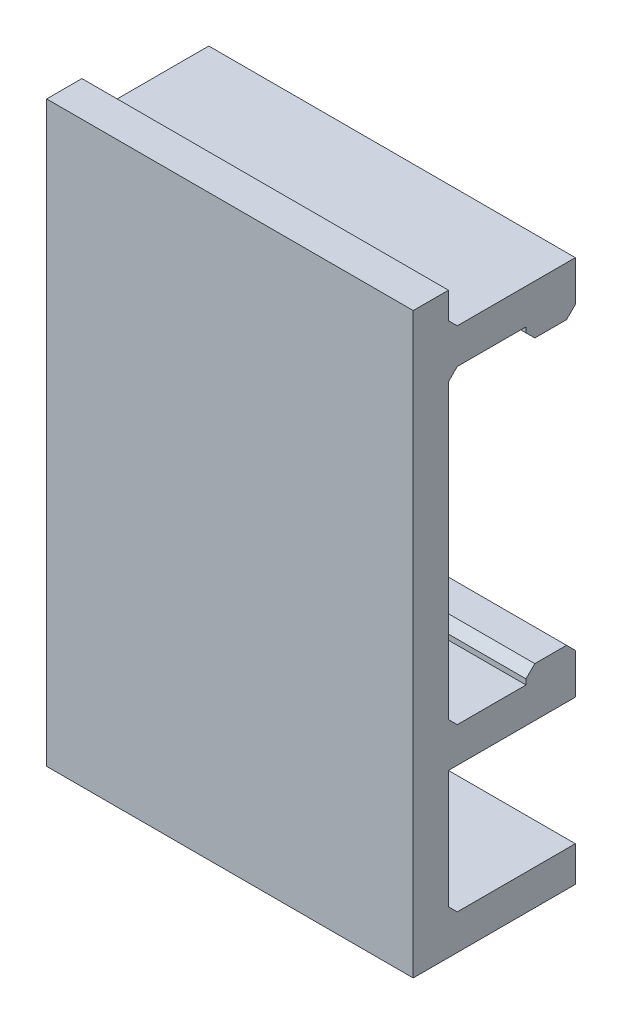
ISO-10303-21;
HEADER;
FILE_DESCRIPTION(('STEP AP214'),'2;1');
FILE_NAME('part.step','',(''),(''),'','','');
FILE_SCHEMA(('AUTOMOTIVE_DESIGN { 1 0 10303 214 1 1 1 1 }'));
ENDSEC;
DATA;
#1=APPLICATION_CONTEXT('core data for automotive mechanical design processes');
#2=APPLICATION_PROTOCOL_DEFINITION('international standard','automotive_design',2000,#1);
#3=PRODUCT_CONTEXT('',#1,'mechanical');
#4=PRODUCT('Part','Part','',(#3));
#5=PRODUCT_RELATED_PRODUCT_CATEGORY('part','',(#4));
#6=PRODUCT_DEFINITION_FORMATION('','',#4);
#7=PRODUCT_DEFINITION_CONTEXT('part definition',#1,'design');
#8=PRODUCT_DEFINITION('design','',#6,#7);
#9=PRODUCT_DEFINITION_SHAPE('','',#8);
#10=(LENGTH_UNIT() NAMED_UNIT(*) SI_UNIT(.MILLI.,.METRE.));
#11=(NAMED_UNIT(*) PLANE_ANGLE_UNIT() SI_UNIT($,.RADIAN.));
#12=(NAMED_UNIT(*) SI_UNIT($,.STERADIAN.) SOLID_ANGLE_UNIT());
#13=UNCERTAINTY_MEASURE_WITH_UNIT(LENGTH_MEASURE(1.E-05),#10,'distance_accuracy_value','');
#14=(GEOMETRIC_REPRESENTATION_CONTEXT(3) GLOBAL_UNCERTAINTY_ASSIGNED_CONTEXT((#13)) GLOBAL_UNIT_ASSIGNED_CONTEXT((#10,
#11,#12)) REPRESENTATION_CONTEXT('',''));
#15=CARTESIAN_POINT('',(0.,0.,0.));
#16=DIRECTION('',(0.,0.,1.));
#17=DIRECTION('',(1.,0.,0.));
#18=AXIS2_PLACEMENT_3D('',#15,#16,#17);
#19=CARTESIAN_POINT('',(2.6,2.9,-1.1));
#20=DIRECTION('',(0.,1.,0.));
#21=DIRECTION('',(0.,0.,1.));
#22=AXIS2_PLACEMENT_3D('',#19,#20,#21);
#23=PLANE('',#22);
#24=DIRECTION('',(1.,0.,0.));
#25=VECTOR('',#24,1.);
#26=CARTESIAN_POINT('',(2.6,2.9,-1.675));
#27=LINE('',#26,#25);
#28=CARTESIAN_POINT('',(-2.6,2.9,-1.675));
#29=VERTEX_POINT('',#28);
#30=CARTESIAN_POINT('',(2.6,2.9,-1.675));
#31=VERTEX_POINT('',#30);
#32=EDGE_CURVE('E235',#29,#31,#27,.T.);
#33=ORIENTED_EDGE('',*,*,#32,.T.);
#34=DIRECTION('',(0.,0.,1.));
#35=VECTOR('',#34,1.);
#36=CARTESIAN_POINT('',(2.6,2.9,-1.1));
#37=LINE('',#36,#35);
#38=CARTESIAN_POINT('',(2.6,2.9,-1.225));
#39=VERTEX_POINT('',#38);
#40=EDGE_CURVE('E20',#39,#31,#37,.F.);
#41=ORIENTED_EDGE('',*,*,#40,.F.);
#42=DIRECTION('',(1.,0.,0.));
#43=VECTOR('',#42,1.);
#44=CARTESIAN_POINT('',(2.6,2.9,-1.225));
#45=LINE('',#44,#43);
#46=CARTESIAN_POINT('',(-2.6,2.9,-1.225));
#47=VERTEX_POINT('',#46);
#48=EDGE_CURVE('E217',#39,#47,#45,.F.);
#49=ORIENTED_EDGE('',*,*,#48,.T.);
#50=DIRECTION('',(0.,0.,1.));
#51=VECTOR('',#50,1.);
#52=CARTESIAN_POINT('',(-2.6,2.9,-1.1));
#53=LINE('',#52,#51);
#54=EDGE_CURVE('E209',#29,#47,#53,.T.);
#55=ORIENTED_EDGE('',*,*,#54,.F.);
#56=EDGE_LOOP('',(#33,#41,#49,#55));
#57=FACE_BOUND('',#56,.T.);
#58=ADVANCED_FACE('F17',(#57),#23,.F.);
#59=CARTESIAN_POINT('',(2.6,2.9,-1.225));
#60=DIRECTION('',(0.,0.707106781186548,-0.707106781186548));
#61=DIRECTION('',(0.,0.707106781186548,0.707106781186548));
#62=AXIS2_PLACEMENT_3D('',#59,#60,#61);
#63=PLANE('',#62);
#64=DIRECTION('',(-1.,0.,0.));
#65=VECTOR('',#64,1.);
#66=CARTESIAN_POINT('',(2.6,3.025,-1.1));
#67=LINE('',#66,#65);
#68=CARTESIAN_POINT('',(2.6,3.025,-1.1));
#69=VERTEX_POINT('',#68);
#70=CARTESIAN_POINT('',(-2.6,3.025,-1.1));
#71=VERTEX_POINT('',#70);
#72=EDGE_CURVE('E224',#69,#71,#67,.T.);
#73=ORIENTED_EDGE('',*,*,#72,.T.);
#74=DIRECTION('',(0.,0.707106781186548,0.707106781186548));
#75=VECTOR('',#74,1.);
#76=CARTESIAN_POINT('',(-2.6,2.9,-1.225));
#77=LINE('',#76,#75);
#78=EDGE_CURVE('E212',#47,#71,#77,.T.);
#79=ORIENTED_EDGE('',*,*,#78,.F.);
#80=ORIENTED_EDGE('',*,*,#48,.F.);
#81=DIRECTION('',(0.,0.707106781186548,0.707106781186548));
#82=VECTOR('',#81,1.);
#83=CARTESIAN_POINT('',(2.6,2.9,-1.225));
#84=LINE('',#83,#82);
#85=EDGE_CURVE('E226',#69,#39,#84,.F.);
#86=ORIENTED_EDGE('',*,*,#85,.F.);
#87=EDGE_LOOP('',(#73,#79,#80,#86));
#88=FACE_BOUND('',#87,.T.);
#89=ADVANCED_FACE('F222',(#88),#63,.F.);
#90=CARTESIAN_POINT('',(2.6,-1.225,-1.1));
#91=DIRECTION('',(0.,-0.707106781186548,-0.707106781186548));
#92=DIRECTION('',(0.,0.707106781186548,-0.707106781186548));
#93=AXIS2_PLACEMENT_3D('',#90,#91,#92);
#94=PLANE('',#93);
#95=DIRECTION('',(1.,0.,0.));
#96=VECTOR('',#95,1.);
#97=CARTESIAN_POINT('',(2.6,-1.1,-1.225));
#98=LINE('',#97,#96);
#99=CARTESIAN_POINT('',(2.6,-1.1,-1.225));
#100=VERTEX_POINT('',#99);
#101=CARTESIAN_POINT('',(-2.6,-1.1,-1.225));
#102=VERTEX_POINT('',#101);
#103=EDGE_CURVE('E253',#100,#102,#98,.F.);
#104=ORIENTED_EDGE('',*,*,#103,.T.);
#105=DIRECTION('',(0.,0.707106781186548,-0.707106781186548));
#106=VECTOR('',#105,1.);
#107=CARTESIAN_POINT('',(-2.6,-1.225,-1.1));
#108=LINE('',#107,#106);
#109=CARTESIAN_POINT('',(-2.6,-1.225,-1.1));
#110=VERTEX_POINT('',#109);
#111=EDGE_CURVE('E228',#110,#102,#108,.T.);
#112=ORIENTED_EDGE('',*,*,#111,.F.);
#113=DIRECTION('',(-1.,0.,0.));
#114=VECTOR('',#113,1.);
#115=CARTESIAN_POINT('',(2.6,-1.225,-1.1));
#116=LINE('',#115,#114);
#117=CARTESIAN_POINT('',(2.6,-1.225,-1.1));
#118=VERTEX_POINT('',#117);
#119=EDGE_CURVE('E246',#110,#118,#116,.F.);
#120=ORIENTED_EDGE('',*,*,#119,.T.);
#121=DIRECTION('',(0.,0.707106781186548,-0.707106781186548));
#122=VECTOR('',#121,1.);
#123=CARTESIAN_POINT('',(2.6,-1.225,-1.1));
#124=LINE('',#123,#122);
#125=EDGE_CURVE('E232',#100,#118,#124,.F.);
#126=ORIENTED_EDGE('',*,*,#125,.F.);
#127=EDGE_LOOP('',(#104,#112,#120,#126));
#128=FACE_BOUND('',#127,.T.);
#129=ADVANCED_FACE('F486',(#128),#94,.F.);
#130=CARTESIAN_POINT('',(2.6,3.025,-1.8));
#131=DIRECTION('',(0.,0.707106781186548,0.707106781186548));
#132=DIRECTION('',(0.,-0.707106781186548,0.707106781186548));
#133=AXIS2_PLACEMENT_3D('',#130,#131,#132);
#134=PLANE('',#133);
#135=ORIENTED_EDGE('',*,*,#32,.F.);
#136=DIRECTION('',(0.,-0.707106781186548,0.707106781186548));
#137=VECTOR('',#136,1.);
#138=CARTESIAN_POINT('',(-2.6,3.025,-1.8));
#139=LINE('',#138,#137);
#140=CARTESIAN_POINT('',(-2.6,3.025,-1.8));
#141=VERTEX_POINT('',#140);
#142=EDGE_CURVE('E215',#141,#29,#139,.T.);
#143=ORIENTED_EDGE('',*,*,#142,.F.);
#144=DIRECTION('',(1.,0.,0.));
#145=VECTOR('',#144,1.);
#146=CARTESIAN_POINT('',(2.6,3.025,-1.8));
#147=LINE('',#146,#145);
#148=CARTESIAN_POINT('',(2.6,3.025,-1.8));
#149=VERTEX_POINT('',#148);
#150=EDGE_CURVE('E260',#141,#149,#147,.T.);
#151=ORIENTED_EDGE('',*,*,#150,.T.);
#152=DIRECTION('',(0.,-0.707106781186548,0.707106781186548));
#153=VECTOR('',#152,1.);
#154=CARTESIAN_POINT('',(2.6,3.025,-1.8));
#155=LINE('',#154,#153);
#156=EDGE_CURVE('E237',#31,#149,#155,.F.);
#157=ORIENTED_EDGE('',*,*,#156,.F.);
#158=EDGE_LOOP('',(#135,#143,#151,#157));
#159=FACE_BOUND('',#158,.T.);
#160=ADVANCED_FACE('F590',(#159),#134,.F.);
#161=CARTESIAN_POINT('',(2.6,3.1,-1.1));
#162=DIRECTION('',(0.,0.,-1.));
#163=DIRECTION('',(-1.,0.,0.));
#164=AXIS2_PLACEMENT_3D('',#161,#162,#163);
#165=PLANE('',#164);
#166=ORIENTED_EDGE('',*,*,#72,.F.);
#167=DIRECTION('',(0.,1.,0.));
#168=VECTOR('',#167,1.);
#169=CARTESIAN_POINT('',(2.6,3.1,-1.1));
#170=LINE('',#169,#168);
#171=CARTESIAN_POINT('',(2.6,3.1,-1.1));
#172=VERTEX_POINT('',#171);
#173=EDGE_CURVE('E239',#172,#69,#170,.F.);
#174=ORIENTED_EDGE('',*,*,#173,.F.);
#175=DIRECTION('',(1.,0.,0.));
#176=VECTOR('',#175,1.);
#177=CARTESIAN_POINT('',(2.6,3.1,-1.1));
#178=LINE('',#177,#176);
#179=CARTESIAN_POINT('',(-2.6,3.1,-1.1));
#180=VERTEX_POINT('',#179);
#181=EDGE_CURVE('E265',#172,#180,#178,.F.);
#182=ORIENTED_EDGE('',*,*,#181,.T.);
#183=DIRECTION('',(0.,1.,0.));
#184=VECTOR('',#183,1.);
#185=CARTESIAN_POINT('',(-2.6,3.1,-1.1));
#186=LINE('',#185,#184);
#187=EDGE_CURVE('E242',#71,#180,#186,.T.);
#188=ORIENTED_EDGE('',*,*,#187,.F.);
#189=EDGE_LOOP('',(#166,#174,#182,#188));
#190=FACE_BOUND('',#189,.T.);
#191=ADVANCED_FACE('F503',(#190),#165,.F.);
#192=CARTESIAN_POINT('',(2.6,-1.3,-1.1));
#193=DIRECTION('',(0.,0.,-1.));
#194=DIRECTION('',(-1.,0.,0.));
#195=AXIS2_PLACEMENT_3D('',#192,#193,#194);
#196=PLANE('',#195);
#197=ORIENTED_EDGE('',*,*,#119,.F.);
#198=DIRECTION('',(0.,1.,0.));
#199=VECTOR('',#198,1.);
#200=CARTESIAN_POINT('',(-2.6,-1.3,-1.1));
#201=LINE('',#200,#199);
#202=CARTESIAN_POINT('',(-2.6,-1.3,-1.1));
#203=VERTEX_POINT('',#202);
#204=EDGE_CURVE('E244',#203,#110,#201,.T.);
#205=ORIENTED_EDGE('',*,*,#204,.F.);
#206=DIRECTION('',(1.,0.,0.));
#207=VECTOR('',#206,1.);
#208=CARTESIAN_POINT('',(2.6,-1.3,-1.1));
#209=LINE('',#208,#207);
#210=CARTESIAN_POINT('',(2.6,-1.3,-1.1));
#211=VERTEX_POINT('',#210);
#212=EDGE_CURVE('E273',#203,#211,#209,.T.);
#213=ORIENTED_EDGE('',*,*,#212,.T.);
#214=DIRECTION('',(0.,1.,0.));
#215=VECTOR('',#214,1.);
#216=CARTESIAN_POINT('',(2.6,-1.3,-1.1));
#217=LINE('',#216,#215);
#218=EDGE_CURVE('E249',#118,#211,#217,.F.);
#219=ORIENTED_EDGE('',*,*,#218,.F.);
#220=EDGE_LOOP('',(#197,#205,#213,#219));
#221=FACE_BOUND('',#220,.T.);
#222=ADVANCED_FACE('F493',(#221),#196,.F.);
#223=CARTESIAN_POINT('',(2.6,-1.1,-1.1));
#224=DIRECTION('',(0.,-1.,0.));
#225=DIRECTION('',(0.,0.,-1.));
#226=AXIS2_PLACEMENT_3D('',#223,#224,#225);
#227=PLANE('',#226);
#228=ORIENTED_EDGE('',*,*,#103,.F.);
#229=DIRECTION('',(0.,0.,-1.));
#230=VECTOR('',#229,1.);
#231=CARTESIAN_POINT('',(2.6,-1.1,-1.1));
#232=LINE('',#231,#230);
#233=CARTESIAN_POINT('',(2.6,-1.1,-1.675));
#234=VERTEX_POINT('',#233);
#235=EDGE_CURVE('E251',#234,#100,#232,.F.);
#236=ORIENTED_EDGE('',*,*,#235,.F.);
#237=DIRECTION('',(1.,0.,0.));
#238=VECTOR('',#237,1.);
#239=CARTESIAN_POINT('',(2.6,-1.1,-1.675));
#240=LINE('',#239,#238);
#241=CARTESIAN_POINT('',(-2.6,-1.1,-1.675));
#242=VERTEX_POINT('',#241);
#243=EDGE_CURVE('E287',#234,#242,#240,.F.);
#244=ORIENTED_EDGE('',*,*,#243,.T.);
#245=DIRECTION('',(0.,0.,-1.));
#246=VECTOR('',#245,1.);
#247=CARTESIAN_POINT('',(-2.6,-1.1,-1.1));
#248=LINE('',#247,#246);
#249=EDGE_CURVE('E256',#102,#242,#248,.T.);
#250=ORIENTED_EDGE('',*,*,#249,.F.);
#251=EDGE_LOOP('',(#228,#236,#244,#250));
#252=FACE_BOUND('',#251,.T.);
#253=ADVANCED_FACE('F490',(#252),#227,.F.);
#254=CARTESIAN_POINT('',(2.6,2.9,-1.8));
#255=DIRECTION('',(0.,0.,1.));
#256=DIRECTION('',(1.,0.,0.));
#257=AXIS2_PLACEMENT_3D('',#254,#255,#256);
#258=PLANE('',#257);
#259=ORIENTED_EDGE('',*,*,#150,.F.);
#260=DIRECTION('',(0.,1.,0.));
#261=VECTOR('',#260,1.);
#262=CARTESIAN_POINT('',(-2.6,2.9,-1.8));
#263=LINE('',#262,#261);
#264=CARTESIAN_POINT('',(-2.6,3.6,-1.8));
#265=VERTEX_POINT('',#264);
#266=EDGE_CURVE('E258',#265,#141,#263,.F.);
#267=ORIENTED_EDGE('',*,*,#266,.F.);
#268=DIRECTION('',(1.,0.,0.));
#269=VECTOR('',#268,1.);
#270=CARTESIAN_POINT('',(2.6,3.6,-1.8));
#271=LINE('',#270,#269);
#272=CARTESIAN_POINT('',(2.6,3.6,-1.8));
#273=VERTEX_POINT('',#272);
#274=EDGE_CURVE('E298',#265,#273,#271,.T.);
#275=ORIENTED_EDGE('',*,*,#274,.T.);
#276=DIRECTION('',(0.,1.,0.));
#277=VECTOR('',#276,1.);
#278=CARTESIAN_POINT('',(2.6,2.9,-1.8));
#279=LINE('',#278,#277);
#280=EDGE_CURVE('E263',#149,#273,#279,.T.);
#281=ORIENTED_EDGE('',*,*,#280,.F.);
#282=EDGE_LOOP('',(#259,#267,#275,#281));
#283=FACE_BOUND('',#282,.T.);
#284=ADVANCED_FACE('F492',(#283),#258,.F.);
#285=CARTESIAN_POINT('',(2.6,3.1,0.));
#286=DIRECTION('',(0.,1.,0.));
#287=DIRECTION('',(0.,0.,1.));
#288=AXIS2_PLACEMENT_3D('',#285,#286,#287);
#289=PLANE('',#288);
#290=DIRECTION('',(1.,0.,0.));
#291=VECTOR('',#290,1.);
#292=CARTESIAN_POINT('',(2.6,3.1,-0.125));
#293=LINE('',#292,#291);
#294=CARTESIAN_POINT('',(-2.6,3.1,-0.125));
#295=VERTEX_POINT('',#294);
#296=CARTESIAN_POINT('',(2.6,3.1,-0.125));
#297=VERTEX_POINT('',#296);
#298=EDGE_CURVE('E318',#295,#297,#293,.T.);
#299=ORIENTED_EDGE('',*,*,#298,.F.);
#300=DIRECTION('',(0.,0.,1.));
#301=VECTOR('',#300,1.);
#302=CARTESIAN_POINT('',(-2.6,3.1,0.));
#303=LINE('',#302,#301);
#304=EDGE_CURVE('E268',#180,#295,#303,.T.);
#305=ORIENTED_EDGE('',*,*,#304,.F.);
#306=ORIENTED_EDGE('',*,*,#181,.F.);
#307=DIRECTION('',(0.,0.,1.));
#308=VECTOR('',#307,1.);
#309=CARTESIAN_POINT('',(2.6,3.1,0.));
#310=LINE('',#309,#308);
#311=EDGE_CURVE('E270',#297,#172,#310,.F.);
#312=ORIENTED_EDGE('',*,*,#311,.F.);
#313=EDGE_LOOP('',(#299,#305,#306,#312));
#314=FACE_BOUND('',#313,.T.);
#315=ADVANCED_FACE('F500',(#314),#289,.F.);
#316=CARTESIAN_POINT('',(2.6,-1.3,-1.1));
#317=DIRECTION('',(0.,-1.,0.));
#318=DIRECTION('',(0.,0.,-1.));
#319=AXIS2_PLACEMENT_3D('',#316,#317,#318);
#320=PLANE('',#319);
#321=DIRECTION('',(1.,0.,0.));
#322=VECTOR('',#321,1.);
#323=CARTESIAN_POINT('',(-2.6,-1.3,-0.125));
#324=LINE('',#323,#322);
#325=CARTESIAN_POINT('',(2.6,-1.3,-0.125));
#326=VERTEX_POINT('',#325);
#327=CARTESIAN_POINT('',(-2.6,-1.3,-0.125));
#328=VERTEX_POINT('',#327);
#329=EDGE_CURVE('E324',#326,#328,#324,.F.);
#330=ORIENTED_EDGE('',*,*,#329,.F.);
#331=DIRECTION('',(0.,0.,-1.));
#332=VECTOR('',#331,1.);
#333=CARTESIAN_POINT('',(2.6,-1.3,-1.1));
#334=LINE('',#333,#332);
#335=EDGE_CURVE('E276',#211,#326,#334,.F.);
#336=ORIENTED_EDGE('',*,*,#335,.F.);
#337=ORIENTED_EDGE('',*,*,#212,.F.);
#338=DIRECTION('',(0.,0.,-1.));
#339=VECTOR('',#338,1.);
#340=CARTESIAN_POINT('',(-2.6,-1.3,-1.1));
#341=LINE('',#340,#339);
#342=EDGE_CURVE('E278',#328,#203,#341,.T.);
#343=ORIENTED_EDGE('',*,*,#342,.F.);
#344=EDGE_LOOP('',(#330,#336,#337,#343));
#345=FACE_BOUND('',#344,.T.);
#346=ADVANCED_FACE('F567',(#345),#320,.F.);
#347=CARTESIAN_POINT('',(-2.6,-3.475,0.));
#348=DIRECTION('',(0.,0.707106781186548,-0.707106781186548));
#349=DIRECTION('',(0.,0.707106781186548,0.707106781186548));
#350=AXIS2_PLACEMENT_3D('',#347,#348,#349);
#351=PLANE('',#350);
#352=DIRECTION('',(0.,0.707106781186548,0.707106781186548));
#353=VECTOR('',#352,1.);
#354=CARTESIAN_POINT('',(-2.6,-3.475,0.));
#355=LINE('',#354,#353);
#356=CARTESIAN_POINT('',(-2.6,-3.6,-0.125));
#357=VERTEX_POINT('',#356);
#358=CARTESIAN_POINT('',(-2.6,-3.475,0.));
#359=VERTEX_POINT('',#358);
#360=EDGE_CURVE('E284',#357,#359,#355,.T.);
#361=ORIENTED_EDGE('',*,*,#360,.T.);
#362=DIRECTION('',(1.,0.,0.));
#363=VECTOR('',#362,1.);
#364=CARTESIAN_POINT('',(-2.6,-3.475,0.));
#365=LINE('',#364,#363);
#366=CARTESIAN_POINT('',(2.6,-3.475,0.));
#367=VERTEX_POINT('',#366);
#368=EDGE_CURVE('E331',#359,#367,#365,.T.);
#369=ORIENTED_EDGE('',*,*,#368,.T.);
#370=DIRECTION('',(0.,0.707106781186548,0.707106781186548));
#371=VECTOR('',#370,1.);
#372=CARTESIAN_POINT('',(2.6,-3.475,0.));
#373=LINE('',#372,#371);
#374=CARTESIAN_POINT('',(2.6,-3.6,-0.125));
#375=VERTEX_POINT('',#374);
#376=EDGE_CURVE('E281',#367,#375,#373,.F.);
#377=ORIENTED_EDGE('',*,*,#376,.T.);
#378=DIRECTION('',(1.,0.,0.));
#379=VECTOR('',#378,1.);
#380=CARTESIAN_POINT('',(2.6,-3.6,-0.125));
#381=LINE('',#380,#379);
#382=EDGE_CURVE('E308',#375,#357,#381,.F.);
#383=ORIENTED_EDGE('',*,*,#382,.T.);
#384=EDGE_LOOP('',(#361,#369,#377,#383));
#385=FACE_BOUND('',#384,.T.);
#386=ADVANCED_FACE('F450',(#385),#351,.T.);
#387=CARTESIAN_POINT('',(2.6,-1.1,-1.675));
#388=DIRECTION('',(0.,-0.707106781186548,0.707106781186548));
#389=DIRECTION('',(0.,-0.707106781186548,-0.707106781186548));
#390=AXIS2_PLACEMENT_3D('',#387,#388,#389);
#391=PLANE('',#390);
#392=DIRECTION('',(1.,0.,0.));
#393=VECTOR('',#392,1.);
#394=CARTESIAN_POINT('',(2.6,-1.225,-1.8));
#395=LINE('',#394,#393);
#396=CARTESIAN_POINT('',(2.6,-1.225,-1.8));
#397=VERTEX_POINT('',#396);
#398=CARTESIAN_POINT('',(-2.6,-1.225,-1.8));
#399=VERTEX_POINT('',#398);
#400=EDGE_CURVE('E338',#397,#399,#395,.F.);
#401=ORIENTED_EDGE('',*,*,#400,.T.);
#402=DIRECTION('',(0.,-0.707106781186548,-0.707106781186548));
#403=VECTOR('',#402,1.);
#404=CARTESIAN_POINT('',(-2.6,-1.1,-1.675));
#405=LINE('',#404,#403);
#406=EDGE_CURVE('E290',#242,#399,#405,.T.);
#407=ORIENTED_EDGE('',*,*,#406,.F.);
#408=ORIENTED_EDGE('',*,*,#243,.F.);
#409=DIRECTION('',(0.,-0.707106781186548,-0.707106781186548));
#410=VECTOR('',#409,1.);
#411=CARTESIAN_POINT('',(2.6,-1.1,-1.675));
#412=LINE('',#411,#410);
#413=EDGE_CURVE('E292',#397,#234,#412,.F.);
#414=ORIENTED_EDGE('',*,*,#413,.F.);
#415=EDGE_LOOP('',(#401,#407,#408,#414));
#416=FACE_BOUND('',#415,.T.);
#417=ADVANCED_FACE('F481',(#416),#391,.F.);
#418=CARTESIAN_POINT('',(-1.15,-1.3,-1.8));
#419=DIRECTION('',(0.,1.,0.));
#420=DIRECTION('',(0.,0.,1.));
#421=AXIS2_PLACEMENT_3D('',#418,#419,#420);
#422=PLANE('',#421);
#423=DIRECTION('',(0.,0.,1.));
#424=VECTOR('',#423,1.);
#425=CARTESIAN_POINT('',(-1.15,-1.3,-2.45));
#426=LINE('',#425,#424);
#427=CARTESIAN_POINT('',(-1.15,-1.3,-1.8));
#428=VERTEX_POINT('',#427);
#429=CARTESIAN_POINT('',(-1.15,-1.3,-2.45));
#430=VERTEX_POINT('',#429);
#431=EDGE_CURVE('E348',#428,#430,#426,.F.);
#432=ORIENTED_EDGE('',*,*,#431,.T.);
#433=DIRECTION('',(-1.,0.,0.));
#434=VECTOR('',#433,1.);
#435=CARTESIAN_POINT('',(-1.15,-1.3,-2.45));
#436=LINE('',#435,#434);
#437=CARTESIAN_POINT('',(-2.6,-1.3,-2.45));
#438=VERTEX_POINT('',#437);
#439=EDGE_CURVE('E353',#438,#430,#436,.F.);
#440=ORIENTED_EDGE('',*,*,#439,.F.);
#441=DIRECTION('',(0.,0.,1.));
#442=VECTOR('',#441,1.);
#443=CARTESIAN_POINT('',(-2.6,-1.3,-1.8));
#444=LINE('',#443,#442);
#445=CARTESIAN_POINT('',(-2.6,-1.3,-1.8));
#446=VERTEX_POINT('',#445);
#447=EDGE_CURVE('E295',#438,#446,#444,.T.);
#448=ORIENTED_EDGE('',*,*,#447,.T.);
#449=DIRECTION('',(1.,0.,0.));
#450=VECTOR('',#449,1.);
#451=CARTESIAN_POINT('',(2.6,-1.3,-1.8));
#452=LINE('',#451,#450);
#453=EDGE_CURVE('E343',#446,#428,#452,.T.);
#454=ORIENTED_EDGE('',*,*,#453,.T.);
#455=EDGE_LOOP('',(#432,#440,#448,#454));
#456=FACE_BOUND('',#455,.T.);
#457=ADVANCED_FACE('F475',(#456),#422,.T.);
#458=CARTESIAN_POINT('',(2.6,3.6,-1.8));
#459=DIRECTION('',(0.,-1.,0.));
#460=DIRECTION('',(0.,0.,-1.));
#461=AXIS2_PLACEMENT_3D('',#458,#459,#460);
#462=PLANE('',#461);
#463=DIRECTION('',(1.,0.,0.));
#464=VECTOR('',#463,1.);
#465=CARTESIAN_POINT('',(-2.6,3.6,-0.125));
#466=LINE('',#465,#464);
#467=CARTESIAN_POINT('',(2.6,3.6,-0.125));
#468=VERTEX_POINT('',#467);
#469=CARTESIAN_POINT('',(-2.6,3.6,-0.125));
#470=VERTEX_POINT('',#469);
#471=EDGE_CURVE('E362',#468,#470,#466,.F.);
#472=ORIENTED_EDGE('',*,*,#471,.F.);
#473=DIRECTION('',(0.,0.,-1.));
#474=VECTOR('',#473,1.);
#475=CARTESIAN_POINT('',(2.6,3.6,-1.8));
#476=LINE('',#475,#474);
#477=EDGE_CURVE('E301',#273,#468,#476,.F.);
#478=ORIENTED_EDGE('',*,*,#477,.F.);
#479=ORIENTED_EDGE('',*,*,#274,.F.);
#480=DIRECTION('',(0.,0.,-1.));
#481=VECTOR('',#480,1.);
#482=CARTESIAN_POINT('',(-2.6,3.6,-1.8));
#483=LINE('',#482,#481);
#484=EDGE_CURVE('E303',#470,#265,#483,.T.);
#485=ORIENTED_EDGE('',*,*,#484,.F.);
#486=EDGE_LOOP('',(#472,#478,#479,#485));
#487=FACE_BOUND('',#486,.T.);
#488=ADVANCED_FACE('F557',(#487),#462,.F.);
#489=CARTESIAN_POINT('',(2.6,-3.6,-1.8));
#490=DIRECTION('',(0.,-1.,0.));
#491=DIRECTION('',(0.,0.,-1.));
#492=AXIS2_PLACEMENT_3D('',#489,#490,#491);
#493=PLANE('',#492);
#494=ORIENTED_EDGE('',*,*,#382,.F.);
#495=DIRECTION('',(0.,0.,-1.));
#496=VECTOR('',#495,1.);
#497=CARTESIAN_POINT('',(2.6,-3.6,-1.8));
#498=LINE('',#497,#496);
#499=CARTESIAN_POINT('',(2.6,-3.6,-1.8));
#500=VERTEX_POINT('',#499);
#501=EDGE_CURVE('E306',#500,#375,#498,.F.);
#502=ORIENTED_EDGE('',*,*,#501,.F.);
#503=DIRECTION('',(1.,0.,0.));
#504=VECTOR('',#503,1.);
#505=CARTESIAN_POINT('',(2.6,-3.6,-1.8));
#506=LINE('',#505,#504);
#507=CARTESIAN_POINT('',(-2.6,-3.6,-1.8));
#508=VERTEX_POINT('',#507);
#509=EDGE_CURVE('E369',#500,#508,#506,.F.);
#510=ORIENTED_EDGE('',*,*,#509,.T.);
#511=DIRECTION('',(0.,0.,-1.));
#512=VECTOR('',#511,1.);
#513=CARTESIAN_POINT('',(-2.6,-3.6,-1.8));
#514=LINE('',#513,#512);
#515=EDGE_CURVE('E311',#357,#508,#514,.T.);
#516=ORIENTED_EDGE('',*,*,#515,.F.);
#517=EDGE_LOOP('',(#494,#502,#510,#516));
#518=FACE_BOUND('',#517,.T.);
#519=ADVANCED_FACE('F448',(#518),#493,.F.);
#520=CARTESIAN_POINT('',(2.6,3.1,-0.125));
#521=DIRECTION('',(0.,-0.707106781186548,-0.707106781186548));
#522=DIRECTION('',(0.,0.707106781186548,-0.707106781186548));
#523=AXIS2_PLACEMENT_3D('',#520,#521,#522);
#524=PLANE('',#523);
#525=DIRECTION('',(0.,0.707106781186548,-0.707106781186548));
#526=VECTOR('',#525,1.);
#527=CARTESIAN_POINT('',(-2.6,3.1,-0.125));
#528=LINE('',#527,#526);
#529=CARTESIAN_POINT('',(-2.6,2.975,0.));
#530=VERTEX_POINT('',#529);
#531=EDGE_CURVE('E315',#530,#295,#528,.T.);
#532=ORIENTED_EDGE('',*,*,#531,.T.);
#533=ORIENTED_EDGE('',*,*,#298,.T.);
#534=DIRECTION('',(0.,0.707106781186548,-0.707106781186548));
#535=VECTOR('',#534,1.);
#536=CARTESIAN_POINT('',(2.6,3.1,-0.125));
#537=LINE('',#536,#535);
#538=CARTESIAN_POINT('',(2.6,2.975,0.));
#539=VERTEX_POINT('',#538);
#540=EDGE_CURVE('E313',#297,#539,#537,.F.);
#541=ORIENTED_EDGE('',*,*,#540,.T.);
#542=DIRECTION('',(1.,0.,0.));
#543=VECTOR('',#542,1.);
#544=CARTESIAN_POINT('',(-2.6,2.975,0.));
#545=LINE('',#544,#543);
#546=EDGE_CURVE('E372',#539,#530,#545,.F.);
#547=ORIENTED_EDGE('',*,*,#546,.T.);
#548=EDGE_LOOP('',(#532,#533,#541,#547));
#549=FACE_BOUND('',#548,.T.);
#550=ADVANCED_FACE('F550',(#549),#524,.T.);
#551=CARTESIAN_POINT('',(-2.6,-1.175,0.));
#552=DIRECTION('',(0.,0.707106781186548,-0.707106781186548));
#553=DIRECTION('',(0.,0.707106781186548,0.707106781186548));
#554=AXIS2_PLACEMENT_3D('',#551,#552,#553);
#555=PLANE('',#554);
#556=DIRECTION('',(0.,0.707106781186548,0.707106781186548));
#557=VECTOR('',#556,1.);
#558=CARTESIAN_POINT('',(-2.6,-1.175,0.));
#559=LINE('',#558,#557);
#560=CARTESIAN_POINT('',(-2.6,-1.175,0.));
#561=VERTEX_POINT('',#560);
#562=EDGE_CURVE('E327',#328,#561,#559,.T.);
#563=ORIENTED_EDGE('',*,*,#562,.T.);
#564=DIRECTION('',(1.,0.,0.));
#565=VECTOR('',#564,1.);
#566=CARTESIAN_POINT('',(-2.6,-1.175,0.));
#567=LINE('',#566,#565);
#568=CARTESIAN_POINT('',(2.6,-1.175,0.));
#569=VERTEX_POINT('',#568);
#570=EDGE_CURVE('E375',#561,#569,#567,.T.);
#571=ORIENTED_EDGE('',*,*,#570,.T.);
#572=DIRECTION('',(0.,0.707106781186548,0.707106781186548));
#573=VECTOR('',#572,1.);
#574=CARTESIAN_POINT('',(2.6,-1.175,0.));
#575=LINE('',#574,#573);
#576=EDGE_CURVE('E321',#569,#326,#575,.F.);
#577=ORIENTED_EDGE('',*,*,#576,.T.);
#578=ORIENTED_EDGE('',*,*,#329,.T.);
#579=EDGE_LOOP('',(#563,#571,#577,#578));
#580=FACE_BOUND('',#579,.T.);
#581=ADVANCED_FACE('F547',(#580),#555,.T.);
#582=CARTESIAN_POINT('',(-2.6,-4.1,0.));
#583=DIRECTION('',(0.,0.,1.));
#584=DIRECTION('',(1.,0.,0.));
#585=AXIS2_PLACEMENT_3D('',#582,#583,#584);
#586=PLANE('',#585);
#587=ORIENTED_EDGE('',*,*,#368,.F.);
#588=DIRECTION('',(0.,1.,0.));
#589=VECTOR('',#588,1.);
#590=CARTESIAN_POINT('',(-2.6,-4.1,0.));
#591=LINE('',#590,#589);
#592=CARTESIAN_POINT('',(-2.6,-1.8,0.));
#593=VERTEX_POINT('',#592);
#594=EDGE_CURVE('E329',#593,#359,#591,.F.);
#595=ORIENTED_EDGE('',*,*,#594,.F.);
#596=DIRECTION('',(1.,0.,0.));
#597=VECTOR('',#596,1.);
#598=CARTESIAN_POINT('',(2.6,-1.8,0.));
#599=LINE('',#598,#597);
#600=CARTESIAN_POINT('',(2.6,-1.8,0.));
#601=VERTEX_POINT('',#600);
#602=EDGE_CURVE('E378',#593,#601,#599,.T.);
#603=ORIENTED_EDGE('',*,*,#602,.T.);
#604=DIRECTION('',(0.,1.,0.));
#605=VECTOR('',#604,1.);
#606=CARTESIAN_POINT('',(2.6,-4.1,0.));
#607=LINE('',#606,#605);
#608=EDGE_CURVE('E334',#367,#601,#607,.T.);
#609=ORIENTED_EDGE('',*,*,#608,.F.);
#610=EDGE_LOOP('',(#587,#595,#603,#609));
#611=FACE_BOUND('',#610,.T.);
#612=ADVANCED_FACE('F454',(#611),#586,.F.);
#613=CARTESIAN_POINT('',(2.6,-1.8,-1.8));
#614=DIRECTION('',(0.,0.,1.));
#615=DIRECTION('',(1.,0.,0.));
#616=AXIS2_PLACEMENT_3D('',#613,#614,#615);
#617=PLANE('',#616);
#618=ORIENTED_EDGE('',*,*,#453,.F.);
#619=DIRECTION('',(0.,1.,0.));
#620=VECTOR('',#619,1.);
#621=CARTESIAN_POINT('',(-2.6,-1.8,-1.8));
#622=LINE('',#621,#620);
#623=EDGE_CURVE('E341',#399,#446,#622,.F.);
#624=ORIENTED_EDGE('',*,*,#623,.F.);
#625=ORIENTED_EDGE('',*,*,#400,.F.);
#626=DIRECTION('',(0.,1.,0.));
#627=VECTOR('',#626,1.);
#628=CARTESIAN_POINT('',(2.6,-1.8,-1.8));
#629=LINE('',#628,#627);
#630=CARTESIAN_POINT('',(2.6,-1.8,-1.8));
#631=VERTEX_POINT('',#630);
#632=EDGE_CURVE('E336',#631,#397,#629,.T.);
#633=ORIENTED_EDGE('',*,*,#632,.F.);
#634=DIRECTION('',(1.,0.,0.));
#635=VECTOR('',#634,1.);
#636=CARTESIAN_POINT('',(2.6,-1.8,-1.8));
#637=LINE('',#636,#635);
#638=CARTESIAN_POINT('',(-1.15,-1.8,-1.8));
#639=VERTEX_POINT('',#638);
#640=EDGE_CURVE('E381',#631,#639,#637,.F.);
#641=ORIENTED_EDGE('',*,*,#640,.T.);
#642=DIRECTION('',(0.,1.,0.));
#643=VECTOR('',#642,1.);
#644=CARTESIAN_POINT('',(-1.15,-1.3,-1.8));
#645=LINE('',#644,#643);
#646=EDGE_CURVE('E345',#639,#428,#645,.T.);
#647=ORIENTED_EDGE('',*,*,#646,.T.);
#648=EDGE_LOOP('',(#618,#624,#625,#633,#641,#647));
#649=FACE_BOUND('',#648,.T.);
#650=ADVANCED_FACE('F467',(#649),#617,.F.);
#651=CARTESIAN_POINT('',(-1.15,-1.3,-2.45));
#652=DIRECTION('',(-1.,0.,0.));
#653=DIRECTION('',(0.,0.,1.));
#654=AXIS2_PLACEMENT_3D('',#651,#652,#653);
#655=PLANE('',#654);
#656=ORIENTED_EDGE('',*,*,#646,.F.);
#657=DIRECTION('',(0.,0.,1.));
#658=VECTOR('',#657,1.);
#659=CARTESIAN_POINT('',(-1.15,-1.8,0.));
#660=LINE('',#659,#658);
#661=CARTESIAN_POINT('',(-1.15,-1.8,-2.45));
#662=VERTEX_POINT('',#661);
#663=EDGE_CURVE('E383',#639,#662,#660,.F.);
#664=ORIENTED_EDGE('',*,*,#663,.T.);
#665=DIRECTION('',(0.,1.,0.));
#666=VECTOR('',#665,1.);
#667=CARTESIAN_POINT('',(-1.15,-1.3,-2.45));
#668=LINE('',#667,#666);
#669=EDGE_CURVE('E356',#430,#662,#668,.F.);
#670=ORIENTED_EDGE('',*,*,#669,.F.);
#671=ORIENTED_EDGE('',*,*,#431,.F.);
#672=EDGE_LOOP('',(#656,#664,#670,#671));
#673=FACE_BOUND('',#672,.T.);
#674=ADVANCED_FACE('F471',(#673),#655,.F.);
#675=CARTESIAN_POINT('',(-1.15,-1.3,-2.45));
#676=DIRECTION('',(0.,0.,-1.));
#677=DIRECTION('',(-1.,0.,0.));
#678=AXIS2_PLACEMENT_3D('',#675,#676,#677);
#679=PLANE('',#678);
#680=ORIENTED_EDGE('',*,*,#669,.T.);
#681=DIRECTION('',(1.,0.,0.));
#682=VECTOR('',#681,1.);
#683=CARTESIAN_POINT('',(2.6,-1.8,-2.45));
#684=LINE('',#683,#682);
#685=CARTESIAN_POINT('',(-2.6,-1.8,-2.45));
#686=VERTEX_POINT('',#685);
#687=EDGE_CURVE('E385',#662,#686,#684,.F.);
#688=ORIENTED_EDGE('',*,*,#687,.T.);
#689=DIRECTION('',(0.,1.,0.));
#690=VECTOR('',#689,1.);
#691=CARTESIAN_POINT('',(-2.6,-1.3,-2.45));
#692=LINE('',#691,#690);
#693=EDGE_CURVE('E350',#686,#438,#692,.T.);
#694=ORIENTED_EDGE('',*,*,#693,.T.);
#695=ORIENTED_EDGE('',*,*,#439,.T.);
#696=EDGE_LOOP('',(#680,#688,#694,#695));
#697=FACE_BOUND('',#696,.T.);
#698=ADVANCED_FACE('F536',(#697),#679,.T.);
#699=CARTESIAN_POINT('',(-2.6,3.725,0.));
#700=DIRECTION('',(0.,0.707106781186548,-0.707106781186548));
#701=DIRECTION('',(0.,0.707106781186548,0.707106781186548));
#702=AXIS2_PLACEMENT_3D('',#699,#700,#701);
#703=PLANE('',#702);
#704=DIRECTION('',(0.,0.707106781186548,0.707106781186548));
#705=VECTOR('',#704,1.);
#706=CARTESIAN_POINT('',(-2.6,3.725,0.));
#707=LINE('',#706,#705);
#708=CARTESIAN_POINT('',(-2.6,3.725,0.));
#709=VERTEX_POINT('',#708);
#710=EDGE_CURVE('E365',#470,#709,#707,.T.);
#711=ORIENTED_EDGE('',*,*,#710,.T.);
#712=DIRECTION('',(1.,0.,0.));
#713=VECTOR('',#712,1.);
#714=CARTESIAN_POINT('',(-2.6,3.725,0.));
#715=LINE('',#714,#713);
#716=CARTESIAN_POINT('',(2.6,3.725,0.));
#717=VERTEX_POINT('',#716);
#718=EDGE_CURVE('E388',#709,#717,#715,.T.);
#719=ORIENTED_EDGE('',*,*,#718,.T.);
#720=DIRECTION('',(0.,0.707106781186548,0.707106781186548));
#721=VECTOR('',#720,1.);
#722=CARTESIAN_POINT('',(2.6,3.725,0.));
#723=LINE('',#722,#721);
#724=EDGE_CURVE('E359',#717,#468,#723,.F.);
#725=ORIENTED_EDGE('',*,*,#724,.T.);
#726=ORIENTED_EDGE('',*,*,#471,.T.);
#727=EDGE_LOOP('',(#711,#719,#725,#726));
#728=FACE_BOUND('',#727,.T.);
#729=ADVANCED_FACE('F533',(#728),#703,.T.);
#730=CARTESIAN_POINT('',(2.6,-4.1,-1.8));
#731=DIRECTION('',(0.,0.,1.));
#732=DIRECTION('',(1.,0.,0.));
#733=AXIS2_PLACEMENT_3D('',#730,#731,#732);
#734=PLANE('',#733);
#735=ORIENTED_EDGE('',*,*,#509,.F.);
#736=DIRECTION('',(0.,1.,0.));
#737=VECTOR('',#736,1.);
#738=CARTESIAN_POINT('',(2.6,-4.1,-1.8));
#739=LINE('',#738,#737);
#740=CARTESIAN_POINT('',(2.6,-4.1,-1.8));
#741=VERTEX_POINT('',#740);
#742=EDGE_CURVE('E367',#741,#500,#739,.T.);
#743=ORIENTED_EDGE('',*,*,#742,.F.);
#744=DIRECTION('',(1.,0.,0.));
#745=VECTOR('',#744,1.);
#746=CARTESIAN_POINT('',(-2.6,-4.1,-1.8));
#747=LINE('',#746,#745);
#748=CARTESIAN_POINT('',(-2.6,-4.1,-1.8));
#749=VERTEX_POINT('',#748);
#750=EDGE_CURVE('E402',#741,#749,#747,.F.);
#751=ORIENTED_EDGE('',*,*,#750,.T.);
#752=DIRECTION('',(0.,1.,0.));
#753=VECTOR('',#752,1.);
#754=CARTESIAN_POINT('',(-2.6,4.1,-1.8));
#755=LINE('',#754,#753);
#756=EDGE_CURVE('E393',#749,#508,#755,.T.);
#757=ORIENTED_EDGE('',*,*,#756,.T.);
#758=EDGE_LOOP('',(#735,#743,#751,#757));
#759=FACE_BOUND('',#758,.T.);
#760=ADVANCED_FACE('F444',(#759),#734,.F.);
#761=CARTESIAN_POINT('',(-2.6,-4.1,0.));
#762=DIRECTION('',(0.,0.,1.));
#763=DIRECTION('',(1.,0.,0.));
#764=AXIS2_PLACEMENT_3D('',#761,#762,#763);
#765=PLANE('',#764);
#766=ORIENTED_EDGE('',*,*,#570,.F.);
#767=DIRECTION('',(0.,1.,0.));
#768=VECTOR('',#767,1.);
#769=CARTESIAN_POINT('',(-2.6,4.1,0.));
#770=LINE('',#769,#768);
#771=EDGE_CURVE('E399',#561,#530,#770,.T.);
#772=ORIENTED_EDGE('',*,*,#771,.T.);
#773=ORIENTED_EDGE('',*,*,#546,.F.);
#774=DIRECTION('',(0.,1.,0.));
#775=VECTOR('',#774,1.);
#776=CARTESIAN_POINT('',(2.6,-4.1,0.));
#777=LINE('',#776,#775);
#778=EDGE_CURVE('E406',#539,#569,#777,.F.);
#779=ORIENTED_EDGE('',*,*,#778,.T.);
#780=EDGE_LOOP('',(#766,#772,#773,#779));
#781=FACE_BOUND('',#780,.T.);
#782=ADVANCED_FACE('F527',(#781),#765,.F.);
#783=CARTESIAN_POINT('',(2.6,-1.8,0.));
#784=DIRECTION('',(0.,1.,0.));
#785=DIRECTION('',(0.,0.,1.));
#786=AXIS2_PLACEMENT_3D('',#783,#784,#785);
#787=PLANE('',#786);
#788=ORIENTED_EDGE('',*,*,#687,.F.);
#789=ORIENTED_EDGE('',*,*,#663,.F.);
#790=ORIENTED_EDGE('',*,*,#640,.F.);
#791=DIRECTION('',(0.,0.,1.));
#792=VECTOR('',#791,1.);
#793=CARTESIAN_POINT('',(2.6,-1.8,0.5));
#794=LINE('',#793,#792);
#795=EDGE_CURVE('E409',#631,#601,#794,.T.);
#796=ORIENTED_EDGE('',*,*,#795,.T.);
#797=ORIENTED_EDGE('',*,*,#602,.F.);
#798=DIRECTION('',(0.,0.,-1.));
#799=VECTOR('',#798,1.);
#800=CARTESIAN_POINT('',(-2.6,-1.8,0.5));
#801=LINE('',#800,#799);
#802=EDGE_CURVE('E396',#593,#686,#801,.T.);
#803=ORIENTED_EDGE('',*,*,#802,.T.);
#804=EDGE_LOOP('',(#788,#789,#790,#796,#797,#803));
#805=FACE_BOUND('',#804,.T.);
#806=ADVANCED_FACE('F461',(#805),#787,.F.);
#807=CARTESIAN_POINT('',(-2.6,-4.1,0.));
#808=DIRECTION('',(0.,0.,1.));
#809=DIRECTION('',(1.,0.,0.));
#810=AXIS2_PLACEMENT_3D('',#807,#808,#809);
#811=PLANE('',#810);
#812=ORIENTED_EDGE('',*,*,#718,.F.);
#813=DIRECTION('',(0.,1.,0.));
#814=VECTOR('',#813,1.);
#815=CARTESIAN_POINT('',(-2.6,4.1,0.));
#816=LINE('',#815,#814);
#817=CARTESIAN_POINT('',(-2.6,4.1,0.));
#818=VERTEX_POINT('',#817);
#819=EDGE_CURVE('E391',#709,#818,#816,.T.);
#820=ORIENTED_EDGE('',*,*,#819,.T.);
#821=DIRECTION('',(1.,0.,0.));
#822=VECTOR('',#821,1.);
#823=CARTESIAN_POINT('',(2.6,4.1,0.));
#824=LINE('',#823,#822);
#825=CARTESIAN_POINT('',(2.6,4.1,0.));
#826=VERTEX_POINT('',#825);
#827=EDGE_CURVE('E421',#818,#826,#824,.T.);
#828=ORIENTED_EDGE('',*,*,#827,.T.);
#829=DIRECTION('',(0.,1.,0.));
#830=VECTOR('',#829,1.);
#831=CARTESIAN_POINT('',(2.6,-4.1,0.));
#832=LINE('',#831,#830);
#833=EDGE_CURVE('E414',#826,#717,#832,.F.);
#834=ORIENTED_EDGE('',*,*,#833,.T.);
#835=EDGE_LOOP('',(#812,#820,#828,#834));
#836=FACE_BOUND('',#835,.T.);
#837=ADVANCED_FACE('F521',(#836),#811,.F.);
#838=CARTESIAN_POINT('',(-2.6,4.1,0.5));
#839=DIRECTION('',(1.,0.,0.));
#840=DIRECTION('',(0.,0.,-1.));
#841=AXIS2_PLACEMENT_3D('',#838,#839,#840);
#842=PLANE('',#841);
#843=ORIENTED_EDGE('',*,*,#142,.T.);
#844=ORIENTED_EDGE('',*,*,#54,.T.);
#845=ORIENTED_EDGE('',*,*,#78,.T.);
#846=ORIENTED_EDGE('',*,*,#187,.T.);
#847=ORIENTED_EDGE('',*,*,#304,.T.);
#848=ORIENTED_EDGE('',*,*,#531,.F.);
#849=ORIENTED_EDGE('',*,*,#771,.F.);
#850=ORIENTED_EDGE('',*,*,#562,.F.);
#851=ORIENTED_EDGE('',*,*,#342,.T.);
#852=ORIENTED_EDGE('',*,*,#204,.T.);
#853=ORIENTED_EDGE('',*,*,#111,.T.);
#854=ORIENTED_EDGE('',*,*,#249,.T.);
#855=ORIENTED_EDGE('',*,*,#406,.T.);
#856=ORIENTED_EDGE('',*,*,#623,.T.);
#857=ORIENTED_EDGE('',*,*,#447,.F.);
#858=ORIENTED_EDGE('',*,*,#693,.F.);
#859=ORIENTED_EDGE('',*,*,#802,.F.);
#860=ORIENTED_EDGE('',*,*,#594,.T.);
#861=ORIENTED_EDGE('',*,*,#360,.F.);
#862=ORIENTED_EDGE('',*,*,#515,.T.);
#863=ORIENTED_EDGE('',*,*,#756,.F.);
#864=DIRECTION('',(0.,0.,1.));
#865=VECTOR('',#864,1.);
#866=CARTESIAN_POINT('',(-2.6,-4.1,0.5));
#867=LINE('',#866,#865);
#868=CARTESIAN_POINT('',(-2.6,-4.1,0.5));
#869=VERTEX_POINT('',#868);
#870=EDGE_CURVE('E404',#749,#869,#867,.T.);
#871=ORIENTED_EDGE('',*,*,#870,.T.);
#872=DIRECTION('',(0.,1.,0.));
#873=VECTOR('',#872,1.);
#874=CARTESIAN_POINT('',(-2.6,-4.1,0.5));
#875=LINE('',#874,#873);
#876=CARTESIAN_POINT('',(-2.6,4.1,0.5));
#877=VERTEX_POINT('',#876);
#878=EDGE_CURVE('E424',#877,#869,#875,.F.);
#879=ORIENTED_EDGE('',*,*,#878,.F.);
#880=DIRECTION('',(0.,0.,-1.));
#881=VECTOR('',#880,1.);
#882=CARTESIAN_POINT('',(-2.6,4.1,0.5));
#883=LINE('',#882,#881);
#884=EDGE_CURVE('E418',#877,#818,#883,.T.);
#885=ORIENTED_EDGE('',*,*,#884,.T.);
#886=ORIENTED_EDGE('',*,*,#819,.F.);
#887=ORIENTED_EDGE('',*,*,#710,.F.);
#888=ORIENTED_EDGE('',*,*,#484,.T.);
#889=ORIENTED_EDGE('',*,*,#266,.T.);
#890=EDGE_LOOP('',(#843,#844,#845,#846,#847,#848,#849,#850,#851,#852,#853,#854,#855,#856,#857,
#858,#859,#860,#861,#862,#863,#871,#879,#885,#886,#887,#888,#889));
#891=FACE_BOUND('',#890,.T.);
#892=ADVANCED_FACE('F210',(#891),#842,.F.);
#893=CARTESIAN_POINT('',(-2.6,-4.1,0.5));
#894=DIRECTION('',(0.,1.,0.));
#895=DIRECTION('',(0.,0.,1.));
#896=AXIS2_PLACEMENT_3D('',#893,#894,#895);
#897=PLANE('',#896);
#898=ORIENTED_EDGE('',*,*,#750,.F.);
#899=DIRECTION('',(0.,0.,1.));
#900=VECTOR('',#899,1.);
#901=CARTESIAN_POINT('',(2.6,-4.1,0.5));
#902=LINE('',#901,#900);
#903=CARTESIAN_POINT('',(2.6,-4.1,0.5));
#904=VERTEX_POINT('',#903);
#905=EDGE_CURVE('E412',#741,#904,#902,.T.);
#906=ORIENTED_EDGE('',*,*,#905,.T.);
#907=DIRECTION('',(1.,0.,0.));
#908=VECTOR('',#907,1.);
#909=CARTESIAN_POINT('',(-2.6,-4.1,0.5));
#910=LINE('',#909,#908);
#911=EDGE_CURVE('E427',#869,#904,#910,.T.);
#912=ORIENTED_EDGE('',*,*,#911,.F.);
#913=ORIENTED_EDGE('',*,*,#870,.F.);
#914=EDGE_LOOP('',(#898,#906,#912,#913));
#915=FACE_BOUND('',#914,.T.);
#916=ADVANCED_FACE('F439',(#915),#897,.F.);
#917=CARTESIAN_POINT('',(2.6,-4.1,0.5));
#918=DIRECTION('',(-1.,0.,0.));
#919=DIRECTION('',(0.,0.,1.));
#920=AXIS2_PLACEMENT_3D('',#917,#918,#919);
#921=PLANE('',#920);
#922=ORIENTED_EDGE('',*,*,#156,.T.);
#923=ORIENTED_EDGE('',*,*,#280,.T.);
#924=ORIENTED_EDGE('',*,*,#477,.T.);
#925=ORIENTED_EDGE('',*,*,#724,.F.);
#926=ORIENTED_EDGE('',*,*,#833,.F.);
#927=DIRECTION('',(0.,0.,-1.));
#928=VECTOR('',#927,1.);
#929=CARTESIAN_POINT('',(2.6,4.1,0.5));
#930=LINE('',#929,#928);
#931=CARTESIAN_POINT('',(2.6,4.1,0.5));
#932=VERTEX_POINT('',#931);
#933=EDGE_CURVE('E35',#826,#932,#930,.F.);
#934=ORIENTED_EDGE('',*,*,#933,.T.);
#935=DIRECTION('',(0.,1.,0.));
#936=VECTOR('',#935,1.);
#937=CARTESIAN_POINT('',(2.6,-4.1,0.5));
#938=LINE('',#937,#936);
#939=EDGE_CURVE('E26',#904,#932,#938,.T.);
#940=ORIENTED_EDGE('',*,*,#939,.F.);
#941=ORIENTED_EDGE('',*,*,#905,.F.);
#942=ORIENTED_EDGE('',*,*,#742,.T.);
#943=ORIENTED_EDGE('',*,*,#501,.T.);
#944=ORIENTED_EDGE('',*,*,#376,.F.);
#945=ORIENTED_EDGE('',*,*,#608,.T.);
#946=ORIENTED_EDGE('',*,*,#795,.F.);
#947=ORIENTED_EDGE('',*,*,#632,.T.);
#948=ORIENTED_EDGE('',*,*,#413,.T.);
#949=ORIENTED_EDGE('',*,*,#235,.T.);
#950=ORIENTED_EDGE('',*,*,#125,.T.);
#951=ORIENTED_EDGE('',*,*,#218,.T.);
#952=ORIENTED_EDGE('',*,*,#335,.T.);
#953=ORIENTED_EDGE('',*,*,#576,.F.);
#954=ORIENTED_EDGE('',*,*,#778,.F.);
#955=ORIENTED_EDGE('',*,*,#540,.F.);
#956=ORIENTED_EDGE('',*,*,#311,.T.);
#957=ORIENTED_EDGE('',*,*,#173,.T.);
#958=ORIENTED_EDGE('',*,*,#85,.T.);
#959=ORIENTED_EDGE('',*,*,#40,.T.);
#960=EDGE_LOOP('',(#922,#923,#924,#925,#926,#934,#940,#941,#942,#943,#944,#945,#946,#947,#948,
#949,#950,#951,#952,#953,#954,#955,#956,#957,#958,#959));
#961=FACE_BOUND('',#960,.T.);
#962=ADVANCED_FACE('F435',(#961),#921,.F.);
#963=CARTESIAN_POINT('',(2.6,4.1,0.5));
#964=DIRECTION('',(0.,-1.,0.));
#965=DIRECTION('',(0.,0.,-1.));
#966=AXIS2_PLACEMENT_3D('',#963,#964,#965);
#967=PLANE('',#966);
#968=ORIENTED_EDGE('',*,*,#884,.F.);
#969=DIRECTION('',(1.,0.,0.));
#970=VECTOR('',#969,1.);
#971=CARTESIAN_POINT('',(-2.6,4.1,0.5));
#972=LINE('',#971,#970);
#973=EDGE_CURVE('E11',#932,#877,#972,.F.);
#974=ORIENTED_EDGE('',*,*,#973,.F.);
#975=ORIENTED_EDGE('',*,*,#933,.F.);
#976=ORIENTED_EDGE('',*,*,#827,.F.);
#977=EDGE_LOOP('',(#968,#974,#975,#976));
#978=FACE_BOUND('',#977,.T.);
#979=ADVANCED_FACE('F507',(#978),#967,.F.);
#980=CARTESIAN_POINT('',(-2.6,-4.1,0.5));
#981=DIRECTION('',(0.,0.,1.));
#982=DIRECTION('',(1.,0.,0.));
#983=AXIS2_PLACEMENT_3D('',#980,#981,#982);
#984=PLANE('',#983);
#985=ORIENTED_EDGE('',*,*,#939,.T.);
#986=ORIENTED_EDGE('',*,*,#973,.T.);
#987=ORIENTED_EDGE('',*,*,#878,.T.);
#988=ORIENTED_EDGE('',*,*,#911,.T.);
#989=EDGE_LOOP('',(#985,#986,#987,#988));
#990=FACE_BOUND('',#989,.T.);
#991=ADVANCED_FACE('F432',(#990),#984,.T.);
#992=CLOSED_SHELL('',(#58,#89,#129,#160,#191,#222,#253,#284,#315,#346,#386,#417,#457,#488,#519,
#550,#581,#612,#650,#674,#698,#729,#760,#782,#806,#837,#892,#916,#962,#979,#991));
#993=MANIFOLD_SOLID_BREP('B1',#992);
#994=ADVANCED_BREP_SHAPE_REPRESENTATION('',(#18,#993),#14);
#995=SHAPE_DEFINITION_REPRESENTATION(#9,#994);
ENDSEC;
END-ISO-10303-21;
